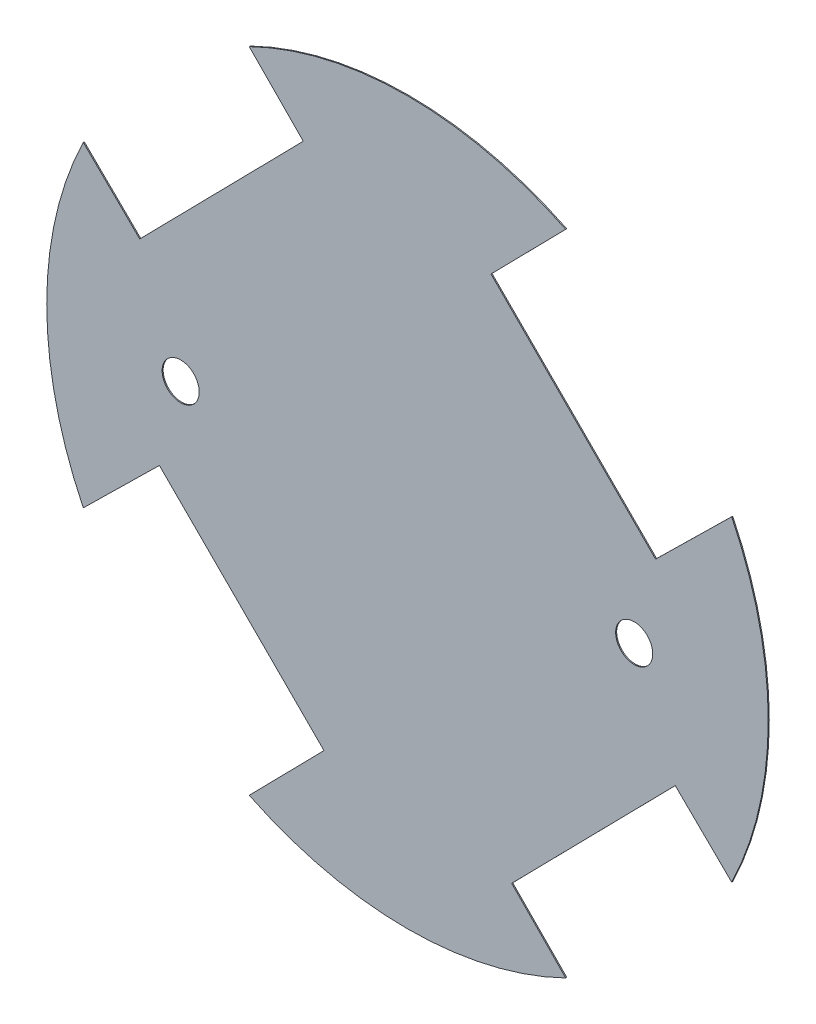
ISO-10303-21;
HEADER;
FILE_DESCRIPTION(('STEP AP214'),'2;1');
FILE_NAME('part.step','',(''),(''),'','','');
FILE_SCHEMA(('AUTOMOTIVE_DESIGN { 1 0 10303 214 1 1 1 1 }'));
ENDSEC;
DATA;
#1=APPLICATION_CONTEXT('core data for automotive mechanical design processes');
#2=APPLICATION_PROTOCOL_DEFINITION('international standard','automotive_design',2000,#1);
#3=PRODUCT_CONTEXT('',#1,'mechanical');
#4=PRODUCT('Part','Part','',(#3));
#5=PRODUCT_RELATED_PRODUCT_CATEGORY('part','',(#4));
#6=PRODUCT_DEFINITION_FORMATION('','',#4);
#7=PRODUCT_DEFINITION_CONTEXT('part definition',#1,'design');
#8=PRODUCT_DEFINITION('design','',#6,#7);
#9=PRODUCT_DEFINITION_SHAPE('','',#8);
#10=(LENGTH_UNIT() NAMED_UNIT(*) SI_UNIT(.MILLI.,.METRE.));
#11=(NAMED_UNIT(*) PLANE_ANGLE_UNIT() SI_UNIT($,.RADIAN.));
#12=(NAMED_UNIT(*) SI_UNIT($,.STERADIAN.) SOLID_ANGLE_UNIT());
#13=UNCERTAINTY_MEASURE_WITH_UNIT(LENGTH_MEASURE(1.E-05),#10,'distance_accuracy_value','');
#14=(GEOMETRIC_REPRESENTATION_CONTEXT(3) GLOBAL_UNCERTAINTY_ASSIGNED_CONTEXT((#13)) GLOBAL_UNIT_ASSIGNED_CONTEXT((#10,
#11,#12)) REPRESENTATION_CONTEXT('',''));
#15=CARTESIAN_POINT('',(0.,0.,0.));
#16=DIRECTION('',(0.,0.,1.));
#17=DIRECTION('',(1.,0.,0.));
#18=AXIS2_PLACEMENT_3D('',#15,#16,#17);
#19=CARTESIAN_POINT('',(0.257754176952285,-1.11022302462516E-13,5.));
#20=DIRECTION('',(0.,0.,-1.));
#21=DIRECTION('',(-1.,0.,0.));
#22=AXIS2_PLACEMENT_3D('',#19,#20,#21);
#23=CYLINDRICAL_SURFACE('',#22,1750.);
#24=CARTESIAN_POINT('',(0.257754176952285,-1.11022302462516E-13,0.));
#25=DIRECTION('',(0.,0.,1.));
#26=DIRECTION('',(1.,0.,0.));
#27=AXIS2_PLACEMENT_3D('',#24,#25,#26);
#28=CIRCLE('',#27,1750.);
#29=CARTESIAN_POINT('',(-767.432407228817,-1572.62577114862,0.));
#30=VERTEX_POINT('',#29);
#31=CARTESIAN_POINT('',(767.947915582713,-1572.62577114862,0.));
#32=VERTEX_POINT('',#31);
#33=EDGE_CURVE('E187',#30,#32,#28,.T.);
#34=ORIENTED_EDGE('',*,*,#33,.T.);
#35=DIRECTION('',(0.,0.,-1.));
#36=VECTOR('',#35,1.);
#37=CARTESIAN_POINT('',(767.947915582713,-1572.62577114862,5.));
#38=LINE('',#37,#36);
#39=CARTESIAN_POINT('',(767.947915582713,-1572.62577114862,5.));
#40=VERTEX_POINT('',#39);
#41=EDGE_CURVE('E11',#40,#32,#38,.T.);
#42=ORIENTED_EDGE('',*,*,#41,.F.);
#43=CARTESIAN_POINT('',(0.257754176952285,-1.11022302462516E-13,5.));
#44=DIRECTION('',(0.,0.,1.));
#45=DIRECTION('',(1.,0.,0.));
#46=AXIS2_PLACEMENT_3D('',#43,#44,#45);
#47=CIRCLE('',#46,1750.);
#48=CARTESIAN_POINT('',(-767.432407228817,-1572.62577114862,5.));
#49=VERTEX_POINT('',#48);
#50=EDGE_CURVE('E234',#49,#40,#47,.T.);
#51=ORIENTED_EDGE('',*,*,#50,.F.);
#52=DIRECTION('',(0.,0.,-1.));
#53=VECTOR('',#52,1.);
#54=CARTESIAN_POINT('',(-767.432407228817,-1572.62577114862,5.));
#55=LINE('',#54,#53);
#56=EDGE_CURVE('E183',#49,#30,#55,.T.);
#57=ORIENTED_EDGE('',*,*,#56,.T.);
#58=EDGE_LOOP('',(#34,#42,#51,#57));
#59=FACE_BOUND('',#58,.T.);
#60=ADVANCED_FACE('F38',(#59),#23,.T.);
#61=CARTESIAN_POINT('',(767.947915582713,-1572.62577114862,5.));
#62=DIRECTION('',(-0.713235928626322,-0.700924040190197,0.));
#63=DIRECTION('',(0.700924040190197,-0.713235928626322,0.));
#64=AXIS2_PLACEMENT_3D('',#61,#62,#63);
#65=PLANE('',#64);
#66=DIRECTION('',(-0.700924040190197,0.713235928626322,0.));
#67=VECTOR('',#66,1.);
#68=CARTESIAN_POINT('',(767.947915582713,-1572.62577114862,0.));
#69=LINE('',#68,#67);
#70=CARTESIAN_POINT('',(505.906479136925,-1305.98151792644,0.));
#71=VERTEX_POINT('',#70);
#72=EDGE_CURVE('E191',#32,#71,#69,.T.);
#73=ORIENTED_EDGE('',*,*,#72,.T.);
#74=DIRECTION('',(0.,0.,-1.));
#75=VECTOR('',#74,1.);
#76=CARTESIAN_POINT('',(505.906479136925,-1305.98151792644,5.));
#77=LINE('',#76,#75);
#78=CARTESIAN_POINT('',(505.906479136925,-1305.98151792644,5.));
#79=VERTEX_POINT('',#78);
#80=EDGE_CURVE('E47',#79,#71,#77,.T.);
#81=ORIENTED_EDGE('',*,*,#80,.F.);
#82=DIRECTION('',(-0.700924040190197,0.713235928626322,0.));
#83=VECTOR('',#82,1.);
#84=CARTESIAN_POINT('',(767.947915582713,-1572.62577114862,5.));
#85=LINE('',#84,#83);
#86=EDGE_CURVE('E122',#40,#79,#85,.T.);
#87=ORIENTED_EDGE('',*,*,#86,.F.);
#88=ORIENTED_EDGE('',*,*,#41,.T.);
#89=EDGE_LOOP('',(#73,#81,#87,#88));
#90=FACE_BOUND('',#89,.T.);
#91=ADVANCED_FACE('F357',(#90),#65,.F.);
#92=CARTESIAN_POINT('',(505.906479136925,-1305.98151792644,5.));
#93=DIRECTION('',(-0.713235928626318,0.700924040190201,0.));
#94=DIRECTION('',(-0.700924040190201,-0.713235928626318,0.));
#95=AXIS2_PLACEMENT_3D('',#92,#93,#94);
#96=PLANE('',#95);
#97=DIRECTION('',(0.700924040190201,0.713235928626318,0.));
#98=VECTOR('',#97,1.);
#99=CARTESIAN_POINT('',(505.906479136925,-1305.98151792644,0.));
#100=LINE('',#99,#98);
#101=CARTESIAN_POINT('',(1299.21132480927,-498.742094188975,0.));
#102=VERTEX_POINT('',#101);
#103=EDGE_CURVE('E195',#71,#102,#100,.T.);
#104=ORIENTED_EDGE('',*,*,#103,.T.);
#105=DIRECTION('',(0.,0.,-1.));
#106=VECTOR('',#105,1.);
#107=CARTESIAN_POINT('',(1299.21132480927,-498.742094188975,5.));
#108=LINE('',#107,#106);
#109=CARTESIAN_POINT('',(1299.21132480927,-498.742094188975,5.));
#110=VERTEX_POINT('',#109);
#111=EDGE_CURVE('E277',#110,#102,#108,.T.);
#112=ORIENTED_EDGE('',*,*,#111,.F.);
#113=DIRECTION('',(0.700924040190201,0.713235928626318,0.));
#114=VECTOR('',#113,1.);
#115=CARTESIAN_POINT('',(505.906479136925,-1305.98151792644,5.));
#116=LINE('',#115,#114);
#117=EDGE_CURVE('E287',#79,#110,#116,.T.);
#118=ORIENTED_EDGE('',*,*,#117,.F.);
#119=ORIENTED_EDGE('',*,*,#80,.T.);
#120=EDGE_LOOP('',(#104,#112,#118,#119));
#121=FACE_BOUND('',#120,.T.);
#122=ADVANCED_FACE('F285',(#121),#96,.F.);
#123=CARTESIAN_POINT('',(1299.21132480927,-498.742094188975,5.));
#124=DIRECTION('',(0.700924040190201,0.713235928626317,0.));
#125=DIRECTION('',(-0.713235928626317,0.700924040190201,0.));
#126=AXIS2_PLACEMENT_3D('',#123,#124,#125);
#127=PLANE('',#126);
#128=DIRECTION('',(0.713235928626317,-0.700924040190201,0.));
#129=VECTOR('',#128,1.);
#130=CARTESIAN_POINT('',(1299.21132480927,-498.742094188975,0.));
#131=LINE('',#130,#129);
#132=CARTESIAN_POINT('',(1572.88352532557,-767.69016140577,0.));
#133=VERTEX_POINT('',#132);
#134=EDGE_CURVE('E198',#102,#133,#131,.T.);
#135=ORIENTED_EDGE('',*,*,#134,.T.);
#136=DIRECTION('',(0.,0.,-1.));
#137=VECTOR('',#136,1.);
#138=CARTESIAN_POINT('',(1572.88352532557,-767.69016140577,5.));
#139=LINE('',#138,#137);
#140=CARTESIAN_POINT('',(1572.88352532557,-767.69016140577,5.));
#141=VERTEX_POINT('',#140);
#142=EDGE_CURVE('E273',#141,#133,#139,.T.);
#143=ORIENTED_EDGE('',*,*,#142,.F.);
#144=DIRECTION('',(0.713235928626317,-0.700924040190201,0.));
#145=VECTOR('',#144,1.);
#146=CARTESIAN_POINT('',(1299.21132480927,-498.742094188975,5.));
#147=LINE('',#146,#145);
#148=EDGE_CURVE('E306',#110,#141,#147,.T.);
#149=ORIENTED_EDGE('',*,*,#148,.F.);
#150=ORIENTED_EDGE('',*,*,#111,.T.);
#151=EDGE_LOOP('',(#135,#143,#149,#150));
#152=FACE_BOUND('',#151,.T.);
#153=ADVANCED_FACE('F296',(#152),#127,.F.);
#154=CARTESIAN_POINT('',(0.257754176952285,-1.11022302462516E-13,5.));
#155=DIRECTION('',(0.,0.,-1.));
#156=DIRECTION('',(-1.,0.,0.));
#157=AXIS2_PLACEMENT_3D('',#154,#155,#156);
#158=CYLINDRICAL_SURFACE('',#157,1750.);
#159=CARTESIAN_POINT('',(0.257754176952285,-1.11022302462516E-13,0.));
#160=DIRECTION('',(0.,0.,1.));
#161=DIRECTION('',(1.,0.,0.));
#162=AXIS2_PLACEMENT_3D('',#159,#160,#161);
#163=CIRCLE('',#162,1750.);
#164=CARTESIAN_POINT('',(1572.88352532565,767.690161405613,0.));
#165=VERTEX_POINT('',#164);
#166=EDGE_CURVE('E201',#133,#165,#163,.T.);
#167=ORIENTED_EDGE('',*,*,#166,.T.);
#168=DIRECTION('',(0.,0.,-1.));
#169=VECTOR('',#168,1.);
#170=CARTESIAN_POINT('',(1572.88352532565,767.690161405613,5.));
#171=LINE('',#170,#169);
#172=CARTESIAN_POINT('',(1572.88352532565,767.690161405613,5.));
#173=VERTEX_POINT('',#172);
#174=EDGE_CURVE('E269',#173,#165,#171,.T.);
#175=ORIENTED_EDGE('',*,*,#174,.F.);
#176=CARTESIAN_POINT('',(0.257754176952285,-1.11022302462516E-13,5.));
#177=DIRECTION('',(0.,0.,1.));
#178=DIRECTION('',(1.,0.,0.));
#179=AXIS2_PLACEMENT_3D('',#176,#177,#178);
#180=CIRCLE('',#179,1750.);
#181=EDGE_CURVE('E302',#141,#173,#180,.T.);
#182=ORIENTED_EDGE('',*,*,#181,.F.);
#183=ORIENTED_EDGE('',*,*,#142,.T.);
#184=EDGE_LOOP('',(#167,#175,#182,#183));
#185=FACE_BOUND('',#184,.T.);
#186=ADVANCED_FACE('F300',(#185),#158,.T.);
#187=CARTESIAN_POINT('',(1572.88352532565,767.690161405613,5.));
#188=DIRECTION('',(0.700924040190196,-0.713235928626322,0.));
#189=DIRECTION('',(0.713235928626322,0.700924040190197,0.));
#190=AXIS2_PLACEMENT_3D('',#187,#188,#189);
#191=PLANE('',#190);
#192=DIRECTION('',(-0.713235928626322,-0.700924040190196,0.));
#193=VECTOR('',#192,1.);
#194=CARTESIAN_POINT('',(1572.88352532565,767.690161405613,0.));
#195=LINE('',#194,#193);
#196=CARTESIAN_POINT('',(1203.82957372892,405.006824210943,0.));
#197=VERTEX_POINT('',#196);
#198=EDGE_CURVE('E204',#165,#197,#195,.T.);
#199=ORIENTED_EDGE('',*,*,#198,.T.);
#200=DIRECTION('',(0.,0.,-1.));
#201=VECTOR('',#200,1.);
#202=CARTESIAN_POINT('',(1203.82957372892,405.006824210943,5.));
#203=LINE('',#202,#201);
#204=CARTESIAN_POINT('',(1203.82957372892,405.006824210943,5.));
#205=VERTEX_POINT('',#204);
#206=EDGE_CURVE('E265',#205,#197,#203,.T.);
#207=ORIENTED_EDGE('',*,*,#206,.F.);
#208=DIRECTION('',(-0.713235928626322,-0.700924040190196,0.));
#209=VECTOR('',#208,1.);
#210=CARTESIAN_POINT('',(1572.88352532565,767.690161405613,5.));
#211=LINE('',#210,#209);
#212=EDGE_CURVE('E305',#173,#205,#211,.T.);
#213=ORIENTED_EDGE('',*,*,#212,.F.);
#214=ORIENTED_EDGE('',*,*,#174,.T.);
#215=EDGE_LOOP('',(#199,#207,#213,#214));
#216=FACE_BOUND('',#215,.T.);
#217=ADVANCED_FACE('F370',(#216),#191,.F.);
#218=CARTESIAN_POINT('',(1203.82957372892,405.006824210943,5.));
#219=DIRECTION('',(-0.707106781186547,-0.707106781186548,0.));
#220=DIRECTION('',(0.707106781186548,-0.707106781186547,0.));
#221=AXIS2_PLACEMENT_3D('',#218,#219,#220);
#222=PLANE('',#221);
#223=DIRECTION('',(-0.707106781186548,0.707106781186547,0.));
#224=VECTOR('',#223,1.);
#225=CARTESIAN_POINT('',(1203.82957372892,405.006824210943,0.));
#226=LINE('',#225,#224);
#227=CARTESIAN_POINT('',(405.264578388122,1203.57181955174,0.));
#228=VERTEX_POINT('',#227);
#229=EDGE_CURVE('E207',#197,#228,#226,.T.);
#230=ORIENTED_EDGE('',*,*,#229,.T.);
#231=DIRECTION('',(0.,0.,-1.));
#232=VECTOR('',#231,1.);
#233=CARTESIAN_POINT('',(405.264578388122,1203.57181955174,5.));
#234=LINE('',#233,#232);
#235=CARTESIAN_POINT('',(405.264578388122,1203.57181955174,5.));
#236=VERTEX_POINT('',#235);
#237=EDGE_CURVE('E261',#236,#228,#234,.T.);
#238=ORIENTED_EDGE('',*,*,#237,.F.);
#239=DIRECTION('',(-0.707106781186548,0.707106781186547,0.));
#240=VECTOR('',#239,1.);
#241=CARTESIAN_POINT('',(1203.82957372892,405.006824210943,5.));
#242=LINE('',#241,#240);
#243=EDGE_CURVE('E310',#205,#236,#242,.T.);
#244=ORIENTED_EDGE('',*,*,#243,.F.);
#245=ORIENTED_EDGE('',*,*,#206,.T.);
#246=EDGE_LOOP('',(#230,#238,#244,#245));
#247=FACE_BOUND('',#246,.T.);
#248=ADVANCED_FACE('F373',(#247),#222,.F.);
#249=CARTESIAN_POINT('',(405.264578388122,1203.57181955174,5.));
#250=DIRECTION('',(-0.713235928626318,0.7009240401902,0.));
#251=DIRECTION('',(-0.7009240401902,-0.713235928626318,0.));
#252=AXIS2_PLACEMENT_3D('',#249,#250,#251);
#253=PLANE('',#252);
#254=DIRECTION('',(0.7009240401902,0.713235928626318,0.));
#255=VECTOR('',#254,1.);
#256=CARTESIAN_POINT('',(405.264578388122,1203.57181955174,0.));
#257=LINE('',#256,#255);
#258=CARTESIAN_POINT('',(767.947915582871,1572.62577114854,0.));
#259=VERTEX_POINT('',#258);
#260=EDGE_CURVE('E210',#228,#259,#257,.T.);
#261=ORIENTED_EDGE('',*,*,#260,.T.);
#262=DIRECTION('',(0.,0.,-1.));
#263=VECTOR('',#262,1.);
#264=CARTESIAN_POINT('',(767.947915582871,1572.62577114854,5.));
#265=LINE('',#264,#263);
#266=CARTESIAN_POINT('',(767.947915582871,1572.62577114854,5.));
#267=VERTEX_POINT('',#266);
#268=EDGE_CURVE('E257',#267,#259,#265,.T.);
#269=ORIENTED_EDGE('',*,*,#268,.F.);
#270=DIRECTION('',(0.7009240401902,0.713235928626318,0.));
#271=VECTOR('',#270,1.);
#272=CARTESIAN_POINT('',(405.264578388122,1203.57181955174,5.));
#273=LINE('',#272,#271);
#274=EDGE_CURVE('E317',#236,#267,#273,.T.);
#275=ORIENTED_EDGE('',*,*,#274,.F.);
#276=ORIENTED_EDGE('',*,*,#237,.T.);
#277=EDGE_LOOP('',(#261,#269,#275,#276));
#278=FACE_BOUND('',#277,.T.);
#279=ADVANCED_FACE('F377',(#278),#253,.F.);
#280=CARTESIAN_POINT('',(0.257754176952285,-1.11022302462516E-13,5.));
#281=DIRECTION('',(0.,0.,-1.));
#282=DIRECTION('',(-1.,0.,0.));
#283=AXIS2_PLACEMENT_3D('',#280,#281,#282);
#284=CYLINDRICAL_SURFACE('',#283,1750.);
#285=CARTESIAN_POINT('',(0.257754176952285,-1.11022302462516E-13,0.));
#286=DIRECTION('',(0.,0.,1.));
#287=DIRECTION('',(1.,0.,0.));
#288=AXIS2_PLACEMENT_3D('',#285,#286,#287);
#289=CIRCLE('',#288,1750.);
#290=CARTESIAN_POINT('',(-767.432407228796,1572.62577114863,0.));
#291=VERTEX_POINT('',#290);
#292=EDGE_CURVE('E213',#259,#291,#289,.T.);
#293=ORIENTED_EDGE('',*,*,#292,.T.);
#294=DIRECTION('',(0.,0.,-1.));
#295=VECTOR('',#294,1.);
#296=CARTESIAN_POINT('',(-767.432407228796,1572.62577114863,5.));
#297=LINE('',#296,#295);
#298=CARTESIAN_POINT('',(-767.432407228796,1572.62577114863,5.));
#299=VERTEX_POINT('',#298);
#300=EDGE_CURVE('E253',#299,#291,#297,.T.);
#301=ORIENTED_EDGE('',*,*,#300,.F.);
#302=CARTESIAN_POINT('',(0.257754176952285,-1.11022302462516E-13,5.));
#303=DIRECTION('',(0.,0.,1.));
#304=DIRECTION('',(1.,0.,0.));
#305=AXIS2_PLACEMENT_3D('',#302,#303,#304);
#306=CIRCLE('',#305,1750.);
#307=EDGE_CURVE('E320',#267,#299,#306,.T.);
#308=ORIENTED_EDGE('',*,*,#307,.F.);
#309=ORIENTED_EDGE('',*,*,#268,.T.);
#310=EDGE_LOOP('',(#293,#301,#308,#309));
#311=FACE_BOUND('',#310,.T.);
#312=ADVANCED_FACE('F381',(#311),#284,.T.);
#313=CARTESIAN_POINT('',(-767.432407228797,1572.62577114863,5.));
#314=DIRECTION('',(0.713235928626327,0.700924040190192,0.));
#315=DIRECTION('',(-0.700924040190192,0.713235928626327,0.));
#316=AXIS2_PLACEMENT_3D('',#313,#314,#315);
#317=PLANE('',#316);
#318=DIRECTION('',(0.700924040190192,-0.713235928626327,0.));
#319=VECTOR('',#318,1.);
#320=CARTESIAN_POINT('',(-767.432407228797,1572.62577114863,0.));
#321=LINE('',#320,#319);
#322=CARTESIAN_POINT('',(-505.39097078301,1305.98151792645,0.));
#323=VERTEX_POINT('',#322);
#324=EDGE_CURVE('E216',#291,#323,#321,.T.);
#325=ORIENTED_EDGE('',*,*,#324,.T.);
#326=DIRECTION('',(0.,0.,-1.));
#327=VECTOR('',#326,1.);
#328=CARTESIAN_POINT('',(-505.39097078301,1305.98151792645,5.));
#329=LINE('',#328,#327);
#330=CARTESIAN_POINT('',(-505.39097078301,1305.98151792645,5.));
#331=VERTEX_POINT('',#330);
#332=EDGE_CURVE('E249',#331,#323,#329,.T.);
#333=ORIENTED_EDGE('',*,*,#332,.F.);
#334=DIRECTION('',(0.700924040190192,-0.713235928626327,0.));
#335=VECTOR('',#334,1.);
#336=CARTESIAN_POINT('',(-767.432407228797,1572.62577114863,5.));
#337=LINE('',#336,#335);
#338=EDGE_CURVE('E323',#299,#331,#337,.T.);
#339=ORIENTED_EDGE('',*,*,#338,.F.);
#340=ORIENTED_EDGE('',*,*,#300,.T.);
#341=EDGE_LOOP('',(#325,#333,#339,#340));
#342=FACE_BOUND('',#341,.T.);
#343=ADVANCED_FACE('F385',(#342),#317,.F.);
#344=CARTESIAN_POINT('',(-505.39097078301,1305.98151792645,5.));
#345=DIRECTION('',(0.713235928626313,-0.700924040190206,0.));
#346=DIRECTION('',(0.700924040190206,0.713235928626313,0.));
#347=AXIS2_PLACEMENT_3D('',#344,#345,#346);
#348=PLANE('',#347);
#349=DIRECTION('',(-0.700924040190206,-0.713235928626313,0.));
#350=VECTOR('',#349,1.);
#351=CARTESIAN_POINT('',(-505.39097078301,1305.98151792645,0.));
#352=LINE('',#351,#350);
#353=CARTESIAN_POINT('',(-1298.69581645537,498.742094188982,0.));
#354=VERTEX_POINT('',#353);
#355=EDGE_CURVE('E219',#323,#354,#352,.T.);
#356=ORIENTED_EDGE('',*,*,#355,.T.);
#357=DIRECTION('',(0.,0.,-1.));
#358=VECTOR('',#357,1.);
#359=CARTESIAN_POINT('',(-1298.69581645537,498.742094188982,5.));
#360=LINE('',#359,#358);
#361=CARTESIAN_POINT('',(-1298.69581645537,498.742094188982,5.));
#362=VERTEX_POINT('',#361);
#363=EDGE_CURVE('E245',#362,#354,#360,.T.);
#364=ORIENTED_EDGE('',*,*,#363,.F.);
#365=DIRECTION('',(-0.700924040190206,-0.713235928626313,0.));
#366=VECTOR('',#365,1.);
#367=CARTESIAN_POINT('',(-505.39097078301,1305.98151792645,5.));
#368=LINE('',#367,#366);
#369=EDGE_CURVE('E326',#331,#362,#368,.T.);
#370=ORIENTED_EDGE('',*,*,#369,.F.);
#371=ORIENTED_EDGE('',*,*,#332,.T.);
#372=EDGE_LOOP('',(#356,#364,#370,#371));
#373=FACE_BOUND('',#372,.T.);
#374=ADVANCED_FACE('F389',(#373),#348,.F.);
#375=CARTESIAN_POINT('',(-1298.69581645537,498.742094188982,5.));
#376=DIRECTION('',(-0.700924040190206,-0.713235928626312,0.));
#377=DIRECTION('',(0.713235928626312,-0.700924040190206,0.));
#378=AXIS2_PLACEMENT_3D('',#375,#376,#377);
#379=PLANE('',#378);
#380=DIRECTION('',(-0.713235928626312,0.700924040190206,0.));
#381=VECTOR('',#380,1.);
#382=CARTESIAN_POINT('',(-1298.69581645537,498.742094188982,0.));
#383=LINE('',#382,#381);
#384=CARTESIAN_POINT('',(-1572.36801697166,767.690161405779,0.));
#385=VERTEX_POINT('',#384);
#386=EDGE_CURVE('E222',#354,#385,#383,.T.);
#387=ORIENTED_EDGE('',*,*,#386,.T.);
#388=DIRECTION('',(0.,0.,-1.));
#389=VECTOR('',#388,1.);
#390=CARTESIAN_POINT('',(-1572.36801697166,767.690161405779,5.));
#391=LINE('',#390,#389);
#392=CARTESIAN_POINT('',(-1572.36801697166,767.690161405779,5.));
#393=VERTEX_POINT('',#392);
#394=EDGE_CURVE('E241',#393,#385,#391,.T.);
#395=ORIENTED_EDGE('',*,*,#394,.F.);
#396=DIRECTION('',(-0.713235928626312,0.700924040190206,0.));
#397=VECTOR('',#396,1.);
#398=CARTESIAN_POINT('',(-1298.69581645537,498.742094188982,5.));
#399=LINE('',#398,#397);
#400=EDGE_CURVE('E329',#362,#393,#399,.T.);
#401=ORIENTED_EDGE('',*,*,#400,.F.);
#402=ORIENTED_EDGE('',*,*,#363,.T.);
#403=EDGE_LOOP('',(#387,#395,#401,#402));
#404=FACE_BOUND('',#403,.T.);
#405=ADVANCED_FACE('F337',(#404),#379,.F.);
#406=CARTESIAN_POINT('',(0.257754176952285,-1.11022302462516E-13,5.));
#407=DIRECTION('',(0.,0.,-1.));
#408=DIRECTION('',(-1.,0.,0.));
#409=AXIS2_PLACEMENT_3D('',#406,#407,#408);
#410=CYLINDRICAL_SURFACE('',#409,1750.);
#411=CARTESIAN_POINT('',(0.257754176952285,-1.11022302462516E-13,0.));
#412=DIRECTION('',(0.,0.,1.));
#413=DIRECTION('',(1.,0.,0.));
#414=AXIS2_PLACEMENT_3D('',#411,#412,#413);
#415=CIRCLE('',#414,1750.);
#416=CARTESIAN_POINT('',(-1572.36801697167,-767.690161405758,0.));
#417=VERTEX_POINT('',#416);
#418=EDGE_CURVE('E225',#385,#417,#415,.T.);
#419=ORIENTED_EDGE('',*,*,#418,.T.);
#420=DIRECTION('',(0.,0.,-1.));
#421=VECTOR('',#420,1.);
#422=CARTESIAN_POINT('',(-1572.36801697167,-767.690161405758,5.));
#423=LINE('',#422,#421);
#424=CARTESIAN_POINT('',(-1572.36801697167,-767.690161405758,5.));
#425=VERTEX_POINT('',#424);
#426=EDGE_CURVE('E176',#425,#417,#423,.T.);
#427=ORIENTED_EDGE('',*,*,#426,.F.);
#428=CARTESIAN_POINT('',(0.257754176952285,-1.11022302462516E-13,5.));
#429=DIRECTION('',(0.,0.,1.));
#430=DIRECTION('',(1.,0.,0.));
#431=AXIS2_PLACEMENT_3D('',#428,#429,#430);
#432=CIRCLE('',#431,1750.);
#433=EDGE_CURVE('E165',#393,#425,#432,.T.);
#434=ORIENTED_EDGE('',*,*,#433,.F.);
#435=ORIENTED_EDGE('',*,*,#394,.T.);
#436=EDGE_LOOP('',(#419,#427,#434,#435));
#437=FACE_BOUND('',#436,.T.);
#438=ADVANCED_FACE('F341',(#437),#410,.T.);
#439=CARTESIAN_POINT('',(-1572.36801697167,-767.690161405759,5.));
#440=DIRECTION('',(-0.700924040190197,0.713235928626322,0.));
#441=DIRECTION('',(-0.713235928626322,-0.700924040190197,0.));
#442=AXIS2_PLACEMENT_3D('',#439,#440,#441);
#443=PLANE('',#442);
#444=DIRECTION('',(0.713235928626322,0.700924040190197,0.));
#445=VECTOR('',#444,1.);
#446=CARTESIAN_POINT('',(-1572.36801697167,-767.690161405759,0.));
#447=LINE('',#446,#445);
#448=CARTESIAN_POINT('',(-1203.31406537479,-405.006824210941,0.));
#449=VERTEX_POINT('',#448);
#450=EDGE_CURVE('E174',#417,#449,#447,.T.);
#451=ORIENTED_EDGE('',*,*,#450,.T.);
#452=DIRECTION('',(0.,0.,-1.));
#453=VECTOR('',#452,1.);
#454=CARTESIAN_POINT('',(-1203.31406537479,-405.006824210941,5.));
#455=LINE('',#454,#453);
#456=CARTESIAN_POINT('',(-1203.31406537479,-405.006824210941,5.));
#457=VERTEX_POINT('',#456);
#458=EDGE_CURVE('E171',#457,#449,#455,.T.);
#459=ORIENTED_EDGE('',*,*,#458,.F.);
#460=DIRECTION('',(0.713235928626322,0.700924040190197,0.));
#461=VECTOR('',#460,1.);
#462=CARTESIAN_POINT('',(-1572.36801697167,-767.690161405759,5.));
#463=LINE('',#462,#461);
#464=EDGE_CURVE('E159',#425,#457,#463,.T.);
#465=ORIENTED_EDGE('',*,*,#464,.F.);
#466=ORIENTED_EDGE('',*,*,#426,.T.);
#467=EDGE_LOOP('',(#451,#459,#465,#466));
#468=FACE_BOUND('',#467,.T.);
#469=ADVANCED_FACE('F172',(#468),#443,.F.);
#470=CARTESIAN_POINT('',(-1203.31406537479,-405.006824210941,5.));
#471=DIRECTION('',(0.70710678118655,0.707106781186545,0.));
#472=DIRECTION('',(-0.707106781186545,0.70710678118655,0.));
#473=AXIS2_PLACEMENT_3D('',#470,#471,#472);
#474=PLANE('',#473);
#475=DIRECTION('',(0.707106781186545,-0.70710678118655,0.));
#476=VECTOR('',#475,1.);
#477=CARTESIAN_POINT('',(-1203.31406537479,-405.006824210941,0.));
#478=LINE('',#477,#476);
#479=CARTESIAN_POINT('',(-404.749070033996,-1203.57181955174,0.));
#480=VERTEX_POINT('',#479);
#481=EDGE_CURVE('E108',#449,#480,#478,.T.);
#482=ORIENTED_EDGE('',*,*,#481,.T.);
#483=DIRECTION('',(0.,0.,-1.));
#484=VECTOR('',#483,1.);
#485=CARTESIAN_POINT('',(-404.749070033996,-1203.57181955174,5.));
#486=LINE('',#485,#484);
#487=CARTESIAN_POINT('',(-404.749070033996,-1203.57181955174,5.));
#488=VERTEX_POINT('',#487);
#489=EDGE_CURVE('E177',#488,#480,#486,.T.);
#490=ORIENTED_EDGE('',*,*,#489,.F.);
#491=DIRECTION('',(0.707106781186545,-0.70710678118655,0.));
#492=VECTOR('',#491,1.);
#493=CARTESIAN_POINT('',(-1203.31406537479,-405.006824210941,5.));
#494=LINE('',#493,#492);
#495=EDGE_CURVE('E163',#457,#488,#494,.T.);
#496=ORIENTED_EDGE('',*,*,#495,.F.);
#497=ORIENTED_EDGE('',*,*,#458,.T.);
#498=EDGE_LOOP('',(#482,#490,#496,#497));
#499=FACE_BOUND('',#498,.T.);
#500=ADVANCED_FACE('F179',(#499),#474,.F.);
#501=CARTESIAN_POINT('',(-404.749070033996,-1203.57181955174,5.));
#502=DIRECTION('',(0.713235928626318,-0.700924040190201,0.));
#503=DIRECTION('',(0.700924040190201,0.713235928626318,0.));
#504=AXIS2_PLACEMENT_3D('',#501,#502,#503);
#505=PLANE('',#504);
#506=DIRECTION('',(-0.700924040190201,-0.713235928626318,0.));
#507=VECTOR('',#506,1.);
#508=CARTESIAN_POINT('',(-404.749070033996,-1203.57181955174,0.));
#509=LINE('',#508,#507);
#510=EDGE_CURVE('E114',#480,#30,#509,.T.);
#511=ORIENTED_EDGE('',*,*,#510,.T.);
#512=ORIENTED_EDGE('',*,*,#56,.F.);
#513=DIRECTION('',(-0.700924040190201,-0.713235928626318,0.));
#514=VECTOR('',#513,1.);
#515=CARTESIAN_POINT('',(-404.749070033996,-1203.57181955174,5.));
#516=LINE('',#515,#514);
#517=EDGE_CURVE('E55',#488,#49,#516,.T.);
#518=ORIENTED_EDGE('',*,*,#517,.F.);
#519=ORIENTED_EDGE('',*,*,#489,.T.);
#520=EDGE_LOOP('',(#511,#512,#518,#519));
#521=FACE_BOUND('',#520,.T.);
#522=ADVANCED_FACE('F345',(#521),#505,.F.);
#523=CARTESIAN_POINT('',(0.257754176952285,-1.11022302462516E-13,5.));
#524=DIRECTION('',(0.,0.,1.));
#525=DIRECTION('',(1.,0.,0.));
#526=AXIS2_PLACEMENT_3D('',#523,#524,#525);
#527=PLANE('',#526);
#528=CARTESIAN_POINT('',(-1100.,0.,5.));
#529=DIRECTION('',(0.,0.,1.));
#530=DIRECTION('',(1.,0.,0.));
#531=AXIS2_PLACEMENT_3D('',#528,#529,#530);
#532=CIRCLE('',#531,89.9999999999999);
#533=CARTESIAN_POINT('',(-1010.,0.,5.));
#534=VERTEX_POINT('',#533);
#535=EDGE_CURVE('E192',#534,#534,#532,.F.);
#536=ORIENTED_EDGE('',*,*,#535,.T.);
#537=EDGE_LOOP('',(#536));
#538=FACE_BOUND('',#537,.T.);
#539=CARTESIAN_POINT('',(1100.,-7.68125894545489E-12,5.));
#540=DIRECTION('',(0.,0.,1.));
#541=DIRECTION('',(1.,0.,0.));
#542=AXIS2_PLACEMENT_3D('',#539,#540,#541);
#543=CIRCLE('',#542,90.);
#544=CARTESIAN_POINT('',(1190.,-7.68125894545489E-12,5.));
#545=VERTEX_POINT('',#544);
#546=EDGE_CURVE('E456',#545,#545,#543,.F.);
#547=ORIENTED_EDGE('',*,*,#546,.T.);
#548=EDGE_LOOP('',(#547));
#549=FACE_BOUND('',#548,.T.);
#550=ORIENTED_EDGE('',*,*,#50,.T.);
#551=ORIENTED_EDGE('',*,*,#86,.T.);
#552=ORIENTED_EDGE('',*,*,#117,.T.);
#553=ORIENTED_EDGE('',*,*,#148,.T.);
#554=ORIENTED_EDGE('',*,*,#181,.T.);
#555=ORIENTED_EDGE('',*,*,#212,.T.);
#556=ORIENTED_EDGE('',*,*,#243,.T.);
#557=ORIENTED_EDGE('',*,*,#274,.T.);
#558=ORIENTED_EDGE('',*,*,#307,.T.);
#559=ORIENTED_EDGE('',*,*,#338,.T.);
#560=ORIENTED_EDGE('',*,*,#369,.T.);
#561=ORIENTED_EDGE('',*,*,#400,.T.);
#562=ORIENTED_EDGE('',*,*,#433,.T.);
#563=ORIENTED_EDGE('',*,*,#464,.T.);
#564=ORIENTED_EDGE('',*,*,#495,.T.);
#565=ORIENTED_EDGE('',*,*,#517,.T.);
#566=EDGE_LOOP('',(#550,#551,#552,#553,#554,#555,#556,#557,#558,#559,#560,#561,#562,#563,#564,#565));
#567=FACE_BOUND('',#566,.T.);
#568=ADVANCED_FACE('F161',(#538,#549,#567),#527,.T.);
#569=CARTESIAN_POINT('',(0.257754176952285,-1.11022302462516E-13,0.));
#570=DIRECTION('',(0.,0.,1.));
#571=DIRECTION('',(1.,0.,0.));
#572=AXIS2_PLACEMENT_3D('',#569,#570,#571);
#573=PLANE('',#572);
#574=CARTESIAN_POINT('',(-1100.,0.,0.));
#575=DIRECTION('',(0.,0.,1.));
#576=DIRECTION('',(1.,0.,0.));
#577=AXIS2_PLACEMENT_3D('',#574,#575,#576);
#578=CIRCLE('',#577,89.9999999999999);
#579=CARTESIAN_POINT('',(-1010.,0.,0.));
#580=VERTEX_POINT('',#579);
#581=EDGE_CURVE('E454',#580,#580,#578,.T.);
#582=ORIENTED_EDGE('',*,*,#581,.T.);
#583=EDGE_LOOP('',(#582));
#584=FACE_BOUND('',#583,.T.);
#585=CARTESIAN_POINT('',(1100.,-7.68125894545489E-12,0.));
#586=DIRECTION('',(0.,0.,1.));
#587=DIRECTION('',(1.,0.,0.));
#588=AXIS2_PLACEMENT_3D('',#585,#586,#587);
#589=CIRCLE('',#588,90.);
#590=CARTESIAN_POINT('',(1190.,-7.68125894545489E-12,0.));
#591=VERTEX_POINT('',#590);
#592=EDGE_CURVE('E457',#591,#591,#589,.T.);
#593=ORIENTED_EDGE('',*,*,#592,.T.);
#594=EDGE_LOOP('',(#593));
#595=FACE_BOUND('',#594,.T.);
#596=ORIENTED_EDGE('',*,*,#33,.F.);
#597=ORIENTED_EDGE('',*,*,#510,.F.);
#598=ORIENTED_EDGE('',*,*,#481,.F.);
#599=ORIENTED_EDGE('',*,*,#450,.F.);
#600=ORIENTED_EDGE('',*,*,#418,.F.);
#601=ORIENTED_EDGE('',*,*,#386,.F.);
#602=ORIENTED_EDGE('',*,*,#355,.F.);
#603=ORIENTED_EDGE('',*,*,#324,.F.);
#604=ORIENTED_EDGE('',*,*,#292,.F.);
#605=ORIENTED_EDGE('',*,*,#260,.F.);
#606=ORIENTED_EDGE('',*,*,#229,.F.);
#607=ORIENTED_EDGE('',*,*,#198,.F.);
#608=ORIENTED_EDGE('',*,*,#166,.F.);
#609=ORIENTED_EDGE('',*,*,#134,.F.);
#610=ORIENTED_EDGE('',*,*,#103,.F.);
#611=ORIENTED_EDGE('',*,*,#72,.F.);
#612=EDGE_LOOP('',(#596,#597,#598,#599,#600,#601,#602,#603,#604,#605,#606,#607,#608,#609,#610,#611));
#613=FACE_BOUND('',#612,.T.);
#614=ADVANCED_FACE('F291',(#584,#595,#613),#573,.F.);
#615=CARTESIAN_POINT('',(1100.,-7.68125894545489E-12,10.));
#616=DIRECTION('',(0.,0.,-1.));
#617=DIRECTION('',(-1.,0.,0.));
#618=AXIS2_PLACEMENT_3D('',#615,#616,#617);
#619=CYLINDRICAL_SURFACE('',#618,90.);
#620=ORIENTED_EDGE('',*,*,#546,.F.);
#621=EDGE_LOOP('',(#620));
#622=FACE_BOUND('',#621,.T.);
#623=ORIENTED_EDGE('',*,*,#592,.F.);
#624=EDGE_LOOP('',(#623));
#625=FACE_BOUND('',#624,.T.);
#626=ADVANCED_FACE('F426',(#622,#625),#619,.F.);
#627=CARTESIAN_POINT('',(-1100.,0.,10.));
#628=DIRECTION('',(0.,0.,-1.));
#629=DIRECTION('',(-1.,0.,0.));
#630=AXIS2_PLACEMENT_3D('',#627,#628,#629);
#631=CYLINDRICAL_SURFACE('',#630,89.9999999999999);
#632=ORIENTED_EDGE('',*,*,#535,.F.);
#633=EDGE_LOOP('',(#632));
#634=FACE_BOUND('',#633,.T.);
#635=ORIENTED_EDGE('',*,*,#581,.F.);
#636=EDGE_LOOP('',(#635));
#637=FACE_BOUND('',#636,.T.);
#638=ADVANCED_FACE('F435',(#634,#637),#631,.F.);
#639=CLOSED_SHELL('',(#60,#91,#122,#153,#186,#217,#248,#279,#312,#343,#374,#405,#438,#469,#500,
#522,#568,#614,#626,#638));
#640=MANIFOLD_SOLID_BREP('B2',#639);
#641=ADVANCED_BREP_SHAPE_REPRESENTATION('',(#18,#640),#14);
#642=SHAPE_DEFINITION_REPRESENTATION(#9,#641);
ENDSEC;
END-ISO-10303-21;
